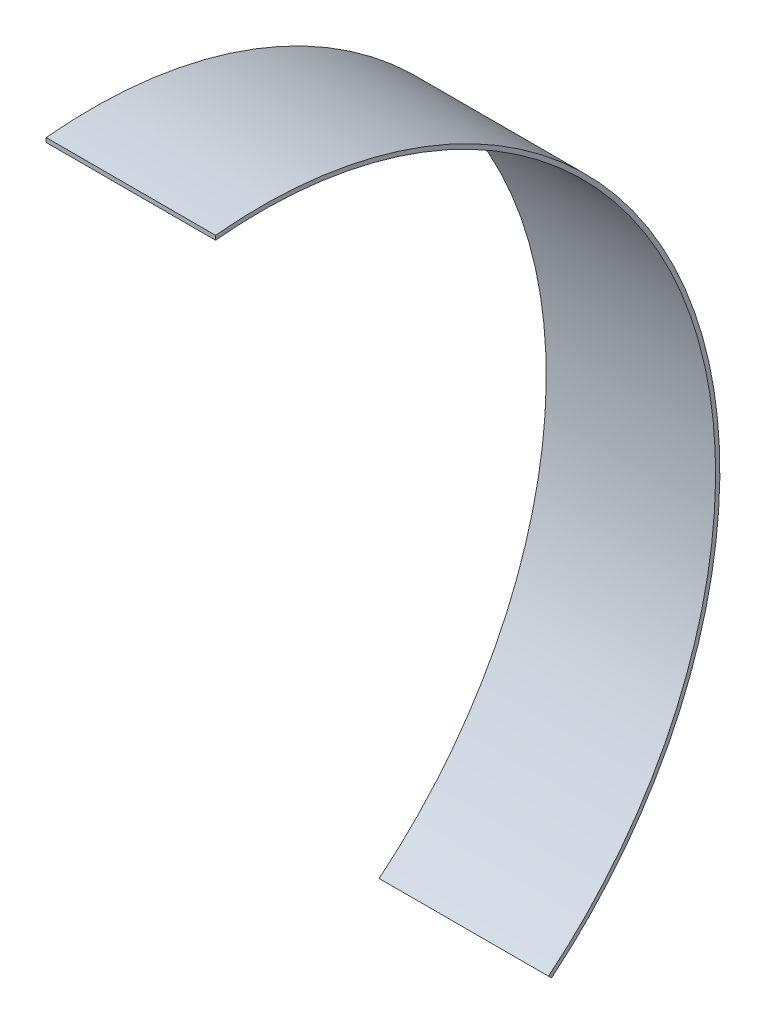
ISO-10303-21;
HEADER;
FILE_DESCRIPTION(('STEP AP214'),'2;1');
FILE_NAME('part.step','',(''),(''),'','','');
FILE_SCHEMA(('AUTOMOTIVE_DESIGN { 1 0 10303 214 1 1 1 1 }'));
ENDSEC;
DATA;
#1=APPLICATION_CONTEXT('core data for automotive mechanical design processes');
#2=APPLICATION_PROTOCOL_DEFINITION('international standard','automotive_design',2000,#1);
#3=PRODUCT_CONTEXT('',#1,'mechanical');
#4=PRODUCT('Part','Part','',(#3));
#5=PRODUCT_RELATED_PRODUCT_CATEGORY('part','',(#4));
#6=PRODUCT_DEFINITION_FORMATION('','',#4);
#7=PRODUCT_DEFINITION_CONTEXT('part definition',#1,'design');
#8=PRODUCT_DEFINITION('design','',#6,#7);
#9=PRODUCT_DEFINITION_SHAPE('','',#8);
#10=(LENGTH_UNIT() NAMED_UNIT(*) SI_UNIT(.MILLI.,.METRE.));
#11=(NAMED_UNIT(*) PLANE_ANGLE_UNIT() SI_UNIT($,.RADIAN.));
#12=(NAMED_UNIT(*) SI_UNIT($,.STERADIAN.) SOLID_ANGLE_UNIT());
#13=UNCERTAINTY_MEASURE_WITH_UNIT(LENGTH_MEASURE(1.E-05),#10,'distance_accuracy_value','');
#14=(GEOMETRIC_REPRESENTATION_CONTEXT(3) GLOBAL_UNCERTAINTY_ASSIGNED_CONTEXT((#13)) GLOBAL_UNIT_ASSIGNED_CONTEXT((#10,
#11,#12)) REPRESENTATION_CONTEXT('',''));
#15=CARTESIAN_POINT('',(0.,0.,0.));
#16=DIRECTION('',(0.,0.,1.));
#17=DIRECTION('',(1.,0.,0.));
#18=AXIS2_PLACEMENT_3D('',#15,#16,#17);
#19=CARTESIAN_POINT('',(13.85,0.,0.));
#20=DIRECTION('',(-1.,0.,0.));
#21=DIRECTION('',(0.,0.,1.));
#22=AXIS2_PLACEMENT_3D('',#19,#20,#21);
#23=CYLINDRICAL_SURFACE('',#22,74.3);
#24=CARTESIAN_POINT('',(-13.85,0.,0.));
#25=DIRECTION('',(1.,0.,0.));
#26=DIRECTION('',(0.,0.,-1.));
#27=AXIS2_PLACEMENT_3D('',#24,#25,#26);
#28=CIRCLE('',#27,74.3);
#29=CARTESIAN_POINT('',(-13.85,-57.57298614588,-46.9663844280812));
#30=VERTEX_POINT('',#29);
#31=CARTESIAN_POINT('',(-13.85,73.9204978338214,7.5));
#32=VERTEX_POINT('',#31);
#33=EDGE_CURVE('E110',#30,#32,#28,.T.);
#34=ORIENTED_EDGE('',*,*,#33,.F.);
#35=DIRECTION('',(-1.,0.,0.));
#36=VECTOR('',#35,1.);
#37=CARTESIAN_POINT('',(13.85,-57.57298614588,-46.9663844280812));
#38=LINE('',#37,#36);
#39=CARTESIAN_POINT('',(13.85,-57.57298614588,-46.9663844280812));
#40=VERTEX_POINT('',#39);
#41=EDGE_CURVE('E11',#40,#30,#38,.T.);
#42=ORIENTED_EDGE('',*,*,#41,.F.);
#43=CARTESIAN_POINT('',(13.85,0.,0.));
#44=DIRECTION('',(1.,0.,0.));
#45=DIRECTION('',(0.,0.,-1.));
#46=AXIS2_PLACEMENT_3D('',#43,#44,#45);
#47=CIRCLE('',#46,74.3);
#48=CARTESIAN_POINT('',(13.85,73.9204978338214,7.5));
#49=VERTEX_POINT('',#48);
#50=EDGE_CURVE('E92',#40,#49,#47,.T.);
#51=ORIENTED_EDGE('',*,*,#50,.T.);
#52=DIRECTION('',(-1.,0.,0.));
#53=VECTOR('',#52,1.);
#54=CARTESIAN_POINT('',(13.85,73.9204978338214,7.5));
#55=LINE('',#54,#53);
#56=EDGE_CURVE('E59',#49,#32,#55,.T.);
#57=ORIENTED_EDGE('',*,*,#56,.T.);
#58=EDGE_LOOP('',(#34,#42,#51,#57));
#59=FACE_BOUND('',#58,.T.);
#60=ADVANCED_FACE('F40',(#59),#23,.F.);
#61=CARTESIAN_POINT('',(13.85,-5.30330085889908,5.30330085889913));
#62=DIRECTION('',(0.,0.707106781186544,-0.707106781186551));
#63=DIRECTION('',(0.,0.707106781186551,0.707106781186544));
#64=AXIS2_PLACEMENT_3D('',#61,#62,#63);
#65=PLANE('',#64);
#66=DIRECTION('',(0.,-0.707106781186551,-0.707106781186544));
#67=VECTOR('',#66,1.);
#68=CARTESIAN_POINT('',(-13.85,-5.30330085889908,5.30330085889913));
#69=LINE('',#68,#67);
#70=CARTESIAN_POINT('',(-13.85,-58.0704781569129,-47.4638764391142));
#71=VERTEX_POINT('',#70);
#72=EDGE_CURVE('E98',#30,#71,#69,.T.);
#73=ORIENTED_EDGE('',*,*,#72,.T.);
#74=DIRECTION('',(-1.,0.,0.));
#75=VECTOR('',#74,1.);
#76=CARTESIAN_POINT('',(13.85,-58.0704781569129,-47.4638764391142));
#77=LINE('',#76,#75);
#78=CARTESIAN_POINT('',(13.85,-58.0704781569129,-47.4638764391142));
#79=VERTEX_POINT('',#78);
#80=EDGE_CURVE('E48',#79,#71,#77,.T.);
#81=ORIENTED_EDGE('',*,*,#80,.F.);
#82=DIRECTION('',(0.,-0.707106781186551,-0.707106781186544));
#83=VECTOR('',#82,1.);
#84=CARTESIAN_POINT('',(13.85,-5.30330085889908,5.30330085889913));
#85=LINE('',#84,#83);
#86=EDGE_CURVE('E86',#40,#79,#85,.T.);
#87=ORIENTED_EDGE('',*,*,#86,.F.);
#88=ORIENTED_EDGE('',*,*,#41,.T.);
#89=EDGE_LOOP('',(#73,#81,#87,#88));
#90=FACE_BOUND('',#89,.T.);
#91=ADVANCED_FACE('F96',(#90),#65,.F.);
#92=CARTESIAN_POINT('',(13.85,0.,0.));
#93=DIRECTION('',(-1.,0.,0.));
#94=DIRECTION('',(0.,0.,1.));
#95=AXIS2_PLACEMENT_3D('',#92,#93,#94);
#96=CYLINDRICAL_SURFACE('',#95,75.);
#97=CARTESIAN_POINT('',(-13.85,0.,0.));
#98=DIRECTION('',(1.,0.,0.));
#99=DIRECTION('',(0.,0.,-1.));
#100=AXIS2_PLACEMENT_3D('',#97,#98,#99);
#101=CIRCLE('',#100,75.);
#102=CARTESIAN_POINT('',(-13.85,74.6240577829965,7.5));
#103=VERTEX_POINT('',#102);
#104=EDGE_CURVE('E114',#71,#103,#101,.T.);
#105=ORIENTED_EDGE('',*,*,#104,.T.);
#106=DIRECTION('',(-1.,0.,0.));
#107=VECTOR('',#106,1.);
#108=CARTESIAN_POINT('',(13.85,74.6240577829965,7.5));
#109=LINE('',#108,#107);
#110=CARTESIAN_POINT('',(13.85,74.6240577829965,7.5));
#111=VERTEX_POINT('',#110);
#112=EDGE_CURVE('E74',#111,#103,#109,.T.);
#113=ORIENTED_EDGE('',*,*,#112,.F.);
#114=CARTESIAN_POINT('',(13.85,0.,0.));
#115=DIRECTION('',(1.,0.,0.));
#116=DIRECTION('',(0.,0.,-1.));
#117=AXIS2_PLACEMENT_3D('',#114,#115,#116);
#118=CIRCLE('',#117,75.);
#119=EDGE_CURVE('E91',#79,#111,#118,.T.);
#120=ORIENTED_EDGE('',*,*,#119,.F.);
#121=ORIENTED_EDGE('',*,*,#80,.T.);
#122=EDGE_LOOP('',(#105,#113,#120,#121));
#123=FACE_BOUND('',#122,.T.);
#124=ADVANCED_FACE('F101',(#123),#96,.T.);
#125=CARTESIAN_POINT('',(13.85,0.,7.5));
#126=DIRECTION('',(0.,0.,1.));
#127=DIRECTION('',(1.,0.,0.));
#128=AXIS2_PLACEMENT_3D('',#125,#126,#127);
#129=PLANE('',#128);
#130=DIRECTION('',(0.,1.,0.));
#131=VECTOR('',#130,1.);
#132=CARTESIAN_POINT('',(-13.85,0.,7.5));
#133=LINE('',#132,#131);
#134=EDGE_CURVE('E116',#32,#103,#133,.T.);
#135=ORIENTED_EDGE('',*,*,#134,.F.);
#136=ORIENTED_EDGE('',*,*,#56,.F.);
#137=DIRECTION('',(0.,1.,0.));
#138=VECTOR('',#137,1.);
#139=CARTESIAN_POINT('',(13.85,0.,7.5));
#140=LINE('',#139,#138);
#141=EDGE_CURVE('E103',#49,#111,#140,.T.);
#142=ORIENTED_EDGE('',*,*,#141,.T.);
#143=ORIENTED_EDGE('',*,*,#112,.T.);
#144=EDGE_LOOP('',(#135,#136,#142,#143));
#145=FACE_BOUND('',#144,.T.);
#146=ADVANCED_FACE('F124',(#145),#129,.T.);
#147=CARTESIAN_POINT('',(13.85,0.,0.));
#148=DIRECTION('',(1.,0.,0.));
#149=DIRECTION('',(0.,0.,-1.));
#150=AXIS2_PLACEMENT_3D('',#147,#148,#149);
#151=PLANE('',#150);
#152=ORIENTED_EDGE('',*,*,#50,.F.);
#153=ORIENTED_EDGE('',*,*,#86,.T.);
#154=ORIENTED_EDGE('',*,*,#119,.T.);
#155=ORIENTED_EDGE('',*,*,#141,.F.);
#156=EDGE_LOOP('',(#152,#153,#154,#155));
#157=FACE_BOUND('',#156,.T.);
#158=ADVANCED_FACE('F88',(#157),#151,.T.);
#159=CARTESIAN_POINT('',(-13.85,0.,0.));
#160=DIRECTION('',(1.,0.,0.));
#161=DIRECTION('',(0.,0.,-1.));
#162=AXIS2_PLACEMENT_3D('',#159,#160,#161);
#163=PLANE('',#162);
#164=ORIENTED_EDGE('',*,*,#33,.T.);
#165=ORIENTED_EDGE('',*,*,#134,.T.);
#166=ORIENTED_EDGE('',*,*,#104,.F.);
#167=ORIENTED_EDGE('',*,*,#72,.F.);
#168=EDGE_LOOP('',(#164,#165,#166,#167));
#169=FACE_BOUND('',#168,.T.);
#170=ADVANCED_FACE('F131',(#169),#163,.F.);
#171=CLOSED_SHELL('',(#60,#91,#124,#146,#158,#170));
#172=MANIFOLD_SOLID_BREP('B2',#171);
#173=ADVANCED_BREP_SHAPE_REPRESENTATION('',(#18,#172),#14);
#174=SHAPE_DEFINITION_REPRESENTATION(#9,#173);
ENDSEC;
END-ISO-10303-21;
